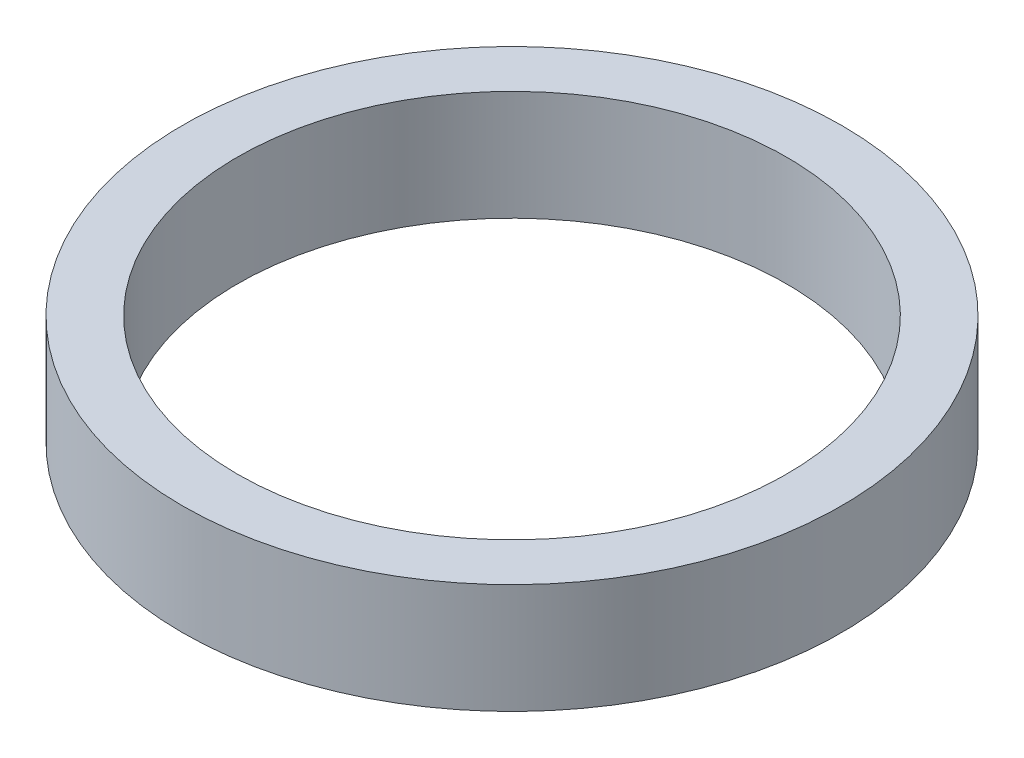
ISO-10303-21;
HEADER;
FILE_DESCRIPTION(('STEP AP214'),'2;1');
FILE_NAME('part.step','',(''),(''),'','','');
FILE_SCHEMA(('AUTOMOTIVE_DESIGN { 1 0 10303 214 1 1 1 1 }'));
ENDSEC;
DATA;
#1=APPLICATION_CONTEXT('core data for automotive mechanical design processes');
#2=APPLICATION_PROTOCOL_DEFINITION('international standard','automotive_design',2000,#1);
#3=PRODUCT_CONTEXT('',#1,'mechanical');
#4=PRODUCT('Part','Part','',(#3));
#5=PRODUCT_RELATED_PRODUCT_CATEGORY('part','',(#4));
#6=PRODUCT_DEFINITION_FORMATION('','',#4);
#7=PRODUCT_DEFINITION_CONTEXT('part definition',#1,'design');
#8=PRODUCT_DEFINITION('design','',#6,#7);
#9=PRODUCT_DEFINITION_SHAPE('','',#8);
#10=(LENGTH_UNIT() NAMED_UNIT(*) SI_UNIT(.MILLI.,.METRE.));
#11=(NAMED_UNIT(*) PLANE_ANGLE_UNIT() SI_UNIT($,.RADIAN.));
#12=(NAMED_UNIT(*) SI_UNIT($,.STERADIAN.) SOLID_ANGLE_UNIT());
#13=UNCERTAINTY_MEASURE_WITH_UNIT(LENGTH_MEASURE(1.E-05),#10,'distance_accuracy_value','');
#14=(GEOMETRIC_REPRESENTATION_CONTEXT(3) GLOBAL_UNCERTAINTY_ASSIGNED_CONTEXT((#13)) GLOBAL_UNIT_ASSIGNED_CONTEXT((#10,
#11,#12)) REPRESENTATION_CONTEXT('',''));
#15=CARTESIAN_POINT('',(0.,0.,0.));
#16=DIRECTION('',(0.,0.,1.));
#17=DIRECTION('',(1.,0.,0.));
#18=AXIS2_PLACEMENT_3D('',#15,#16,#17);
#19=CARTESIAN_POINT('',(0.,5.,0.));
#20=DIRECTION('',(0.,1.,0.));
#21=DIRECTION('',(0.,0.,1.));
#22=AXIS2_PLACEMENT_3D('',#19,#20,#21);
#23=PLANE('',#22);
#24=CARTESIAN_POINT('',(0.,5.,0.));
#25=DIRECTION('',(0.,1.,0.));
#26=DIRECTION('',(0.,0.,1.));
#27=AXIS2_PLACEMENT_3D('',#24,#25,#26);
#28=CIRCLE('',#27,15.);
#29=CARTESIAN_POINT('',(0.,5.,15.));
#30=VERTEX_POINT('',#29);
#31=EDGE_CURVE('E10',#30,#30,#28,.T.);
#32=ORIENTED_EDGE('',*,*,#31,.T.);
#33=EDGE_LOOP('',(#32));
#34=FACE_BOUND('',#33,.T.);
#35=CARTESIAN_POINT('',(0.,5.,0.));
#36=DIRECTION('',(0.,1.,0.));
#37=DIRECTION('',(0.,0.,1.));
#38=AXIS2_PLACEMENT_3D('',#35,#36,#37);
#39=CIRCLE('',#38,12.5);
#40=CARTESIAN_POINT('',(0.,5.,12.5));
#41=VERTEX_POINT('',#40);
#42=EDGE_CURVE('E50',#41,#41,#39,.T.);
#43=ORIENTED_EDGE('',*,*,#42,.F.);
#44=EDGE_LOOP('',(#43));
#45=FACE_BOUND('',#44,.T.);
#46=ADVANCED_FACE('F37',(#34,#45),#23,.T.);
#47=CARTESIAN_POINT('',(0.,0.,0.));
#48=DIRECTION('',(0.,1.,0.));
#49=DIRECTION('',(0.,0.,1.));
#50=AXIS2_PLACEMENT_3D('',#47,#48,#49);
#51=PLANE('',#50);
#52=CARTESIAN_POINT('',(0.,0.,0.));
#53=DIRECTION('',(0.,1.,0.));
#54=DIRECTION('',(0.,0.,1.));
#55=AXIS2_PLACEMENT_3D('',#52,#53,#54);
#56=CIRCLE('',#55,15.);
#57=CARTESIAN_POINT('',(0.,0.,15.));
#58=VERTEX_POINT('',#57);
#59=EDGE_CURVE('E41',#58,#58,#56,.T.);
#60=ORIENTED_EDGE('',*,*,#59,.F.);
#61=EDGE_LOOP('',(#60));
#62=FACE_BOUND('',#61,.T.);
#63=CARTESIAN_POINT('',(0.,0.,0.));
#64=DIRECTION('',(0.,1.,0.));
#65=DIRECTION('',(0.,0.,1.));
#66=AXIS2_PLACEMENT_3D('',#63,#64,#65);
#67=CIRCLE('',#66,12.5);
#68=CARTESIAN_POINT('',(0.,0.,12.5));
#69=VERTEX_POINT('',#68);
#70=EDGE_CURVE('E52',#69,#69,#67,.T.);
#71=ORIENTED_EDGE('',*,*,#70,.T.);
#72=EDGE_LOOP('',(#71));
#73=FACE_BOUND('',#72,.T.);
#74=ADVANCED_FACE('F64',(#62,#73),#51,.F.);
#75=CARTESIAN_POINT('',(0.,5.,0.));
#76=DIRECTION('',(0.,-1.,0.));
#77=DIRECTION('',(0.,0.,-1.));
#78=AXIS2_PLACEMENT_3D('',#75,#76,#77);
#79=CYLINDRICAL_SURFACE('',#78,15.);
#80=ORIENTED_EDGE('',*,*,#31,.F.);
#81=EDGE_LOOP('',(#80));
#82=FACE_BOUND('',#81,.T.);
#83=ORIENTED_EDGE('',*,*,#59,.T.);
#84=EDGE_LOOP('',(#83));
#85=FACE_BOUND('',#84,.T.);
#86=ADVANCED_FACE('F39',(#82,#85),#79,.T.);
#87=CARTESIAN_POINT('',(0.,5.,0.));
#88=DIRECTION('',(0.,-1.,0.));
#89=DIRECTION('',(0.,0.,-1.));
#90=AXIS2_PLACEMENT_3D('',#87,#88,#89);
#91=CYLINDRICAL_SURFACE('',#90,12.5);
#92=ORIENTED_EDGE('',*,*,#42,.T.);
#93=EDGE_LOOP('',(#92));
#94=FACE_BOUND('',#93,.T.);
#95=ORIENTED_EDGE('',*,*,#70,.F.);
#96=EDGE_LOOP('',(#95));
#97=FACE_BOUND('',#96,.T.);
#98=ADVANCED_FACE('F60',(#94,#97),#91,.F.);
#99=CLOSED_SHELL('',(#46,#74,#86,#98));
#100=MANIFOLD_SOLID_BREP('B2',#99);
#101=ADVANCED_BREP_SHAPE_REPRESENTATION('',(#18,#100),#14);
#102=SHAPE_DEFINITION_REPRESENTATION(#9,#101);
ENDSEC;
END-ISO-10303-21;
